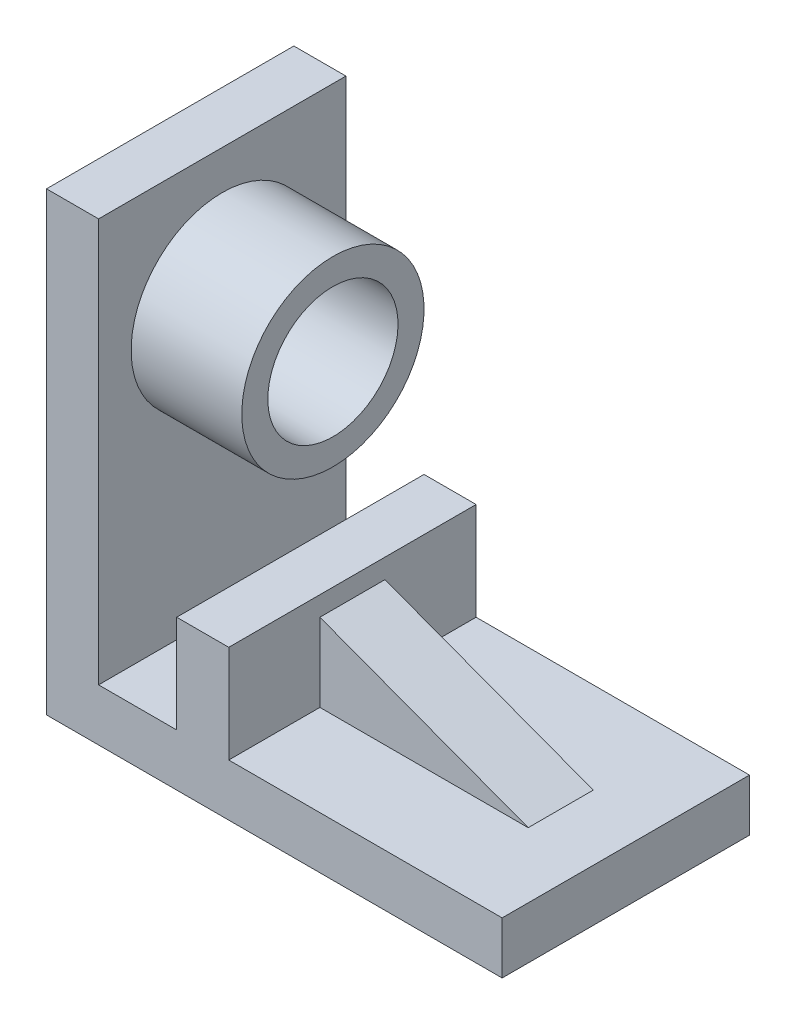
ISO-10303-21;
HEADER;
FILE_DESCRIPTION(('STEP AP214'),'2;1');
FILE_NAME('part.step','',(''),(''),'','','');
FILE_SCHEMA(('AUTOMOTIVE_DESIGN { 1 0 10303 214 1 1 1 1 }'));
ENDSEC;
DATA;
#1=APPLICATION_CONTEXT('core data for automotive mechanical design processes');
#2=APPLICATION_PROTOCOL_DEFINITION('international standard','automotive_design',2000,#1);
#3=PRODUCT_CONTEXT('',#1,'mechanical');
#4=PRODUCT('Part','Part','',(#3));
#5=PRODUCT_RELATED_PRODUCT_CATEGORY('part','',(#4));
#6=PRODUCT_DEFINITION_FORMATION('','',#4);
#7=PRODUCT_DEFINITION_CONTEXT('part definition',#1,'design');
#8=PRODUCT_DEFINITION('design','',#6,#7);
#9=PRODUCT_DEFINITION_SHAPE('','',#8);
#10=(LENGTH_UNIT() NAMED_UNIT(*) SI_UNIT(.MILLI.,.METRE.));
#11=(NAMED_UNIT(*) PLANE_ANGLE_UNIT() SI_UNIT($,.RADIAN.));
#12=(NAMED_UNIT(*) SI_UNIT($,.STERADIAN.) SOLID_ANGLE_UNIT());
#13=UNCERTAINTY_MEASURE_WITH_UNIT(LENGTH_MEASURE(1.E-05),#10,'distance_accuracy_value','');
#14=(GEOMETRIC_REPRESENTATION_CONTEXT(3) GLOBAL_UNCERTAINTY_ASSIGNED_CONTEXT((#13)) GLOBAL_UNIT_ASSIGNED_CONTEXT((#10,
#11,#12)) REPRESENTATION_CONTEXT('',''));
#15=CARTESIAN_POINT('',(0.,0.,0.));
#16=DIRECTION('',(0.,0.,1.));
#17=DIRECTION('',(1.,0.,0.));
#18=AXIS2_PLACEMENT_3D('',#15,#16,#17);
#19=CARTESIAN_POINT('',(-16.0975609756098,-22.1707317073171,38.));
#20=DIRECTION('',(-1.,0.,0.));
#21=DIRECTION('',(0.,-1.,0.));
#22=AXIS2_PLACEMENT_3D('',#19,#20,#21);
#23=PLANE('',#22);
#24=CARTESIAN_POINT('',(-16.0975609756098,19.8292682926829,19.));
#25=DIRECTION('',(-1.,0.,0.));
#26=DIRECTION('',(0.,-1.,0.));
#27=AXIS2_PLACEMENT_3D('',#24,#25,#26);
#28=CIRCLE('',#27,14.);
#29=CARTESIAN_POINT('',(-16.0975609756098,5.82926829268291,19.));
#30=VERTEX_POINT('',#29);
#31=EDGE_CURVE('E11',#30,#30,#28,.F.);
#32=ORIENTED_EDGE('',*,*,#31,.F.);
#33=EDGE_LOOP('',(#32));
#34=FACE_BOUND('',#33,.T.);
#35=DIRECTION('',(0.,0.,-1.));
#36=VECTOR('',#35,1.);
#37=CARTESIAN_POINT('',(-16.0975609756098,-22.1707317073171,38.));
#38=LINE('',#37,#36);
#39=CARTESIAN_POINT('',(-16.0975609756098,-22.1707317073171,38.));
#40=VERTEX_POINT('',#39);
#41=CARTESIAN_POINT('',(-16.0975609756098,-22.1707317073171,0.));
#42=VERTEX_POINT('',#41);
#43=EDGE_CURVE('E181',#40,#42,#38,.T.);
#44=ORIENTED_EDGE('',*,*,#43,.T.);
#45=DIRECTION('',(0.,1.,0.));
#46=VECTOR('',#45,1.);
#47=CARTESIAN_POINT('',(-16.0975609756098,-22.1707317073171,0.));
#48=LINE('',#47,#46);
#49=CARTESIAN_POINT('',(-16.0975609756098,39.8292682926829,0.));
#50=VERTEX_POINT('',#49);
#51=EDGE_CURVE('E158',#42,#50,#48,.T.);
#52=ORIENTED_EDGE('',*,*,#51,.T.);
#53=DIRECTION('',(0.,0.,-1.));
#54=VECTOR('',#53,1.);
#55=CARTESIAN_POINT('',(-16.0975609756098,39.8292682926829,38.));
#56=LINE('',#55,#54);
#57=CARTESIAN_POINT('',(-16.0975609756098,39.8292682926829,38.));
#58=VERTEX_POINT('',#57);
#59=EDGE_CURVE('E42',#58,#50,#56,.T.);
#60=ORIENTED_EDGE('',*,*,#59,.F.);
#61=DIRECTION('',(0.,1.,0.));
#62=VECTOR('',#61,1.);
#63=CARTESIAN_POINT('',(-16.0975609756098,-22.1707317073171,38.));
#64=LINE('',#63,#62);
#65=EDGE_CURVE('E159',#40,#58,#64,.T.);
#66=ORIENTED_EDGE('',*,*,#65,.F.);
#67=EDGE_LOOP('',(#44,#52,#60,#66));
#68=FACE_BOUND('',#67,.T.);
#69=ADVANCED_FACE('F35',(#34,#68),#23,.F.);
#70=CARTESIAN_POINT('',(-16.0975609756098,39.8292682926829,38.));
#71=DIRECTION('',(0.,-1.,0.));
#72=DIRECTION('',(0.,0.,-1.));
#73=AXIS2_PLACEMENT_3D('',#70,#71,#72);
#74=PLANE('',#73);
#75=DIRECTION('',(-1.,0.,0.));
#76=VECTOR('',#75,1.);
#77=CARTESIAN_POINT('',(-16.0975609756098,39.8292682926829,0.));
#78=LINE('',#77,#76);
#79=CARTESIAN_POINT('',(-24.0975609756098,39.8292682926829,0.));
#80=VERTEX_POINT('',#79);
#81=EDGE_CURVE('E184',#50,#80,#78,.T.);
#82=ORIENTED_EDGE('',*,*,#81,.T.);
#83=DIRECTION('',(0.,0.,-1.));
#84=VECTOR('',#83,1.);
#85=CARTESIAN_POINT('',(-24.0975609756098,39.8292682926829,38.));
#86=LINE('',#85,#84);
#87=CARTESIAN_POINT('',(-24.0975609756098,39.8292682926829,38.));
#88=VERTEX_POINT('',#87);
#89=EDGE_CURVE('E225',#88,#80,#86,.T.);
#90=ORIENTED_EDGE('',*,*,#89,.F.);
#91=DIRECTION('',(-1.,0.,0.));
#92=VECTOR('',#91,1.);
#93=CARTESIAN_POINT('',(-16.0975609756098,39.8292682926829,38.));
#94=LINE('',#93,#92);
#95=EDGE_CURVE('E162',#58,#88,#94,.T.);
#96=ORIENTED_EDGE('',*,*,#95,.F.);
#97=ORIENTED_EDGE('',*,*,#59,.T.);
#98=EDGE_LOOP('',(#82,#90,#96,#97));
#99=FACE_BOUND('',#98,.T.);
#100=ADVANCED_FACE('F230',(#99),#74,.F.);
#101=CARTESIAN_POINT('',(-24.0975609756098,39.8292682926829,38.));
#102=DIRECTION('',(1.,0.,0.));
#103=DIRECTION('',(0.,1.,0.));
#104=AXIS2_PLACEMENT_3D('',#101,#102,#103);
#105=PLANE('',#104);
#106=DIRECTION('',(0.,-1.,0.));
#107=VECTOR('',#106,1.);
#108=CARTESIAN_POINT('',(-24.0975609756098,39.8292682926829,0.));
#109=LINE('',#108,#107);
#110=CARTESIAN_POINT('',(-24.0975609756097,-30.1707317073171,0.));
#111=VERTEX_POINT('',#110);
#112=EDGE_CURVE('E186',#80,#111,#109,.T.);
#113=ORIENTED_EDGE('',*,*,#112,.T.);
#114=DIRECTION('',(0.,0.,-1.));
#115=VECTOR('',#114,1.);
#116=CARTESIAN_POINT('',(-24.0975609756097,-30.1707317073171,38.));
#117=LINE('',#116,#115);
#118=CARTESIAN_POINT('',(-24.0975609756097,-30.1707317073171,38.));
#119=VERTEX_POINT('',#118);
#120=EDGE_CURVE('E223',#119,#111,#117,.T.);
#121=ORIENTED_EDGE('',*,*,#120,.F.);
#122=DIRECTION('',(0.,-1.,0.));
#123=VECTOR('',#122,1.);
#124=CARTESIAN_POINT('',(-24.0975609756098,39.8292682926829,38.));
#125=LINE('',#124,#123);
#126=EDGE_CURVE('E165',#88,#119,#125,.T.);
#127=ORIENTED_EDGE('',*,*,#126,.F.);
#128=ORIENTED_EDGE('',*,*,#89,.T.);
#129=EDGE_LOOP('',(#113,#121,#127,#128));
#130=FACE_BOUND('',#129,.T.);
#131=ADVANCED_FACE('F245',(#130),#105,.F.);
#132=CARTESIAN_POINT('',(-24.0975609756097,-30.1707317073171,38.));
#133=DIRECTION('',(0.,1.,0.));
#134=DIRECTION('',(-1.,0.,0.));
#135=AXIS2_PLACEMENT_3D('',#132,#133,#134);
#136=PLANE('',#135);
#137=ORIENTED_EDGE('',*,*,#120,.T.);
#138=DIRECTION('',(1.,0.,0.));
#139=VECTOR('',#138,1.);
#140=CARTESIAN_POINT('',(-24.0975609756097,-30.1707317073171,0.));
#141=LINE('',#140,#139);
#142=CARTESIAN_POINT('',(45.9024390243903,-30.1707317073171,0.));
#143=VERTEX_POINT('',#142);
#144=EDGE_CURVE('E189',#111,#143,#141,.T.);
#145=ORIENTED_EDGE('',*,*,#144,.T.);
#146=DIRECTION('',(0.,0.,-1.));
#147=VECTOR('',#146,1.);
#148=CARTESIAN_POINT('',(45.9024390243903,-30.1707317073171,38.));
#149=LINE('',#148,#147);
#150=CARTESIAN_POINT('',(45.9024390243903,-30.1707317073171,38.));
#151=VERTEX_POINT('',#150);
#152=EDGE_CURVE('E221',#151,#143,#149,.T.);
#153=ORIENTED_EDGE('',*,*,#152,.F.);
#154=DIRECTION('',(1.,0.,0.));
#155=VECTOR('',#154,1.);
#156=CARTESIAN_POINT('',(-24.0975609756097,-30.1707317073171,38.));
#157=LINE('',#156,#155);
#158=EDGE_CURVE('E167',#119,#151,#157,.T.);
#159=ORIENTED_EDGE('',*,*,#158,.F.);
#160=EDGE_LOOP('',(#137,#145,#153,#159));
#161=FACE_BOUND('',#160,.T.);
#162=ADVANCED_FACE('F274',(#161),#136,.F.);
#163=CARTESIAN_POINT('',(45.9024390243903,-30.1707317073171,38.));
#164=DIRECTION('',(-1.,0.,0.));
#165=DIRECTION('',(0.,0.,1.));
#166=AXIS2_PLACEMENT_3D('',#163,#164,#165);
#167=PLANE('',#166);
#168=ORIENTED_EDGE('',*,*,#152,.T.);
#169=DIRECTION('',(0.,1.,0.));
#170=VECTOR('',#169,1.);
#171=CARTESIAN_POINT('',(45.9024390243903,-30.1707317073171,0.));
#172=LINE('',#171,#170);
#173=CARTESIAN_POINT('',(45.9024390243903,-22.1707317073171,0.));
#174=VERTEX_POINT('',#173);
#175=EDGE_CURVE('E192',#143,#174,#172,.T.);
#176=ORIENTED_EDGE('',*,*,#175,.T.);
#177=DIRECTION('',(0.,0.,-1.));
#178=VECTOR('',#177,1.);
#179=CARTESIAN_POINT('',(45.9024390243903,-22.1707317073171,38.));
#180=LINE('',#179,#178);
#181=CARTESIAN_POINT('',(45.9024390243903,-22.1707317073171,38.));
#182=VERTEX_POINT('',#181);
#183=EDGE_CURVE('E218',#182,#174,#180,.T.);
#184=ORIENTED_EDGE('',*,*,#183,.F.);
#185=DIRECTION('',(0.,1.,0.));
#186=VECTOR('',#185,1.);
#187=CARTESIAN_POINT('',(45.9024390243903,-30.1707317073171,38.));
#188=LINE('',#187,#186);
#189=EDGE_CURVE('E169',#151,#182,#188,.T.);
#190=ORIENTED_EDGE('',*,*,#189,.F.);
#191=EDGE_LOOP('',(#168,#176,#184,#190));
#192=FACE_BOUND('',#191,.T.);
#193=ADVANCED_FACE('F271',(#192),#167,.F.);
#194=CARTESIAN_POINT('',(45.9024390243903,-22.1707317073171,38.));
#195=DIRECTION('',(0.,-1.,0.));
#196=DIRECTION('',(1.,0.,0.));
#197=AXIS2_PLACEMENT_3D('',#194,#195,#196);
#198=PLANE('',#197);
#199=DIRECTION('',(0.,0.,-1.));
#200=VECTOR('',#199,1.);
#201=CARTESIAN_POINT('',(35.9024390243902,-22.1707317073171,38.));
#202=LINE('',#201,#200);
#203=CARTESIAN_POINT('',(35.9024390243902,-22.1707317073171,14.));
#204=VERTEX_POINT('',#203);
#205=CARTESIAN_POINT('',(35.9024390243902,-22.1707317073171,24.));
#206=VERTEX_POINT('',#205);
#207=EDGE_CURVE('E49',#204,#206,#202,.F.);
#208=ORIENTED_EDGE('',*,*,#207,.T.);
#209=DIRECTION('',(-1.,0.,0.));
#210=VECTOR('',#209,1.);
#211=CARTESIAN_POINT('',(45.9024390243903,-22.1707317073171,24.));
#212=LINE('',#211,#210);
#213=CARTESIAN_POINT('',(3.90243902439021,-22.1707317073171,24.));
#214=VERTEX_POINT('',#213);
#215=EDGE_CURVE('E138',#206,#214,#212,.T.);
#216=ORIENTED_EDGE('',*,*,#215,.T.);
#217=DIRECTION('',(0.,0.,-1.));
#218=VECTOR('',#217,1.);
#219=CARTESIAN_POINT('',(3.90243902439021,-22.1707317073171,38.));
#220=LINE('',#219,#218);
#221=CARTESIAN_POINT('',(3.90243902439021,-22.1707317073171,38.));
#222=VERTEX_POINT('',#221);
#223=EDGE_CURVE('E216',#222,#214,#220,.T.);
#224=ORIENTED_EDGE('',*,*,#223,.F.);
#225=DIRECTION('',(-1.,0.,0.));
#226=VECTOR('',#225,1.);
#227=CARTESIAN_POINT('',(45.9024390243903,-22.1707317073171,38.));
#228=LINE('',#227,#226);
#229=EDGE_CURVE('E171',#182,#222,#228,.T.);
#230=ORIENTED_EDGE('',*,*,#229,.F.);
#231=ORIENTED_EDGE('',*,*,#183,.T.);
#232=DIRECTION('',(-1.,0.,0.));
#233=VECTOR('',#232,1.);
#234=CARTESIAN_POINT('',(45.9024390243903,-22.1707317073171,0.));
#235=LINE('',#234,#233);
#236=CARTESIAN_POINT('',(3.90243902439021,-22.1707317073171,0.));
#237=VERTEX_POINT('',#236);
#238=EDGE_CURVE('E194',#174,#237,#235,.T.);
#239=ORIENTED_EDGE('',*,*,#238,.T.);
#240=CARTESIAN_POINT('',(3.90243902439021,-22.1707317073171,14.));
#241=VERTEX_POINT('',#240);
#242=EDGE_CURVE('E215',#241,#237,#220,.T.);
#243=ORIENTED_EDGE('',*,*,#242,.F.);
#244=DIRECTION('',(-1.,0.,0.));
#245=VECTOR('',#244,1.);
#246=CARTESIAN_POINT('',(45.9024390243903,-22.1707317073171,14.));
#247=LINE('',#246,#245);
#248=EDGE_CURVE('E54',#204,#241,#247,.T.);
#249=ORIENTED_EDGE('',*,*,#248,.F.);
#250=EDGE_LOOP('',(#208,#216,#224,#230,#231,#239,#243,#249));
#251=FACE_BOUND('',#250,.T.);
#252=ADVANCED_FACE('F267',(#251),#198,.F.);
#253=CARTESIAN_POINT('',(3.90243902439021,-22.1707317073171,38.));
#254=DIRECTION('',(-1.,0.,0.));
#255=DIRECTION('',(0.,-1.,0.));
#256=AXIS2_PLACEMENT_3D('',#253,#254,#255);
#257=PLANE('',#256);
#258=ORIENTED_EDGE('',*,*,#223,.T.);
#259=DIRECTION('',(0.,1.,0.));
#260=VECTOR('',#259,1.);
#261=CARTESIAN_POINT('',(3.90243902439021,-22.1707317073171,24.));
#262=LINE('',#261,#260);
#263=CARTESIAN_POINT('',(3.90243902439022,-10.1707317073171,24.));
#264=VERTEX_POINT('',#263);
#265=EDGE_CURVE('E133',#214,#264,#262,.T.);
#266=ORIENTED_EDGE('',*,*,#265,.T.);
#267=DIRECTION('',(0.,0.,1.));
#268=VECTOR('',#267,1.);
#269=CARTESIAN_POINT('',(3.90243902439022,-10.1707317073171,38.));
#270=LINE('',#269,#268);
#271=CARTESIAN_POINT('',(3.90243902439022,-10.1707317073171,14.));
#272=VERTEX_POINT('',#271);
#273=EDGE_CURVE('E127',#264,#272,#270,.F.);
#274=ORIENTED_EDGE('',*,*,#273,.T.);
#275=DIRECTION('',(0.,1.,0.));
#276=VECTOR('',#275,1.);
#277=CARTESIAN_POINT('',(3.90243902439021,-22.1707317073171,14.));
#278=LINE('',#277,#276);
#279=EDGE_CURVE('E131',#241,#272,#278,.T.);
#280=ORIENTED_EDGE('',*,*,#279,.F.);
#281=ORIENTED_EDGE('',*,*,#242,.T.);
#282=DIRECTION('',(0.,1.,0.));
#283=VECTOR('',#282,1.);
#284=CARTESIAN_POINT('',(3.90243902439021,-22.1707317073171,0.));
#285=LINE('',#284,#283);
#286=CARTESIAN_POINT('',(3.90243902439022,-7.17073170731709,0.));
#287=VERTEX_POINT('',#286);
#288=EDGE_CURVE('E197',#237,#287,#285,.T.);
#289=ORIENTED_EDGE('',*,*,#288,.T.);
#290=DIRECTION('',(0.,0.,-1.));
#291=VECTOR('',#290,1.);
#292=CARTESIAN_POINT('',(3.90243902439022,-7.17073170731709,38.));
#293=LINE('',#292,#291);
#294=CARTESIAN_POINT('',(3.90243902439022,-7.17073170731709,38.));
#295=VERTEX_POINT('',#294);
#296=EDGE_CURVE('E212',#295,#287,#293,.T.);
#297=ORIENTED_EDGE('',*,*,#296,.F.);
#298=DIRECTION('',(0.,1.,0.));
#299=VECTOR('',#298,1.);
#300=CARTESIAN_POINT('',(3.90243902439021,-22.1707317073171,38.));
#301=LINE('',#300,#299);
#302=EDGE_CURVE('E173',#222,#295,#301,.T.);
#303=ORIENTED_EDGE('',*,*,#302,.F.);
#304=EDGE_LOOP('',(#258,#266,#274,#280,#281,#289,#297,#303));
#305=FACE_BOUND('',#304,.T.);
#306=ADVANCED_FACE('F130',(#305),#257,.F.);
#307=CARTESIAN_POINT('',(3.90243902439022,-7.17073170731709,38.));
#308=DIRECTION('',(0.,-1.,0.));
#309=DIRECTION('',(0.,0.,-1.));
#310=AXIS2_PLACEMENT_3D('',#307,#308,#309);
#311=PLANE('',#310);
#312=DIRECTION('',(-1.,0.,0.));
#313=VECTOR('',#312,1.);
#314=CARTESIAN_POINT('',(3.90243902439022,-7.17073170731709,0.));
#315=LINE('',#314,#313);
#316=CARTESIAN_POINT('',(-4.09756097560978,-7.17073170731709,0.));
#317=VERTEX_POINT('',#316);
#318=EDGE_CURVE('E199',#287,#317,#315,.T.);
#319=ORIENTED_EDGE('',*,*,#318,.T.);
#320=DIRECTION('',(0.,0.,-1.));
#321=VECTOR('',#320,1.);
#322=CARTESIAN_POINT('',(-4.09756097560978,-7.17073170731709,38.));
#323=LINE('',#322,#321);
#324=CARTESIAN_POINT('',(-4.09756097560978,-7.17073170731709,38.));
#325=VERTEX_POINT('',#324);
#326=EDGE_CURVE('E210',#325,#317,#323,.T.);
#327=ORIENTED_EDGE('',*,*,#326,.F.);
#328=DIRECTION('',(-1.,0.,0.));
#329=VECTOR('',#328,1.);
#330=CARTESIAN_POINT('',(3.90243902439022,-7.17073170731709,38.));
#331=LINE('',#330,#329);
#332=EDGE_CURVE('E175',#295,#325,#331,.T.);
#333=ORIENTED_EDGE('',*,*,#332,.F.);
#334=ORIENTED_EDGE('',*,*,#296,.T.);
#335=EDGE_LOOP('',(#319,#327,#333,#334));
#336=FACE_BOUND('',#335,.T.);
#337=ADVANCED_FACE('F263',(#336),#311,.F.);
#338=CARTESIAN_POINT('',(-4.09756097560978,-7.17073170731709,38.));
#339=DIRECTION('',(1.,0.,0.));
#340=DIRECTION('',(0.,1.,0.));
#341=AXIS2_PLACEMENT_3D('',#338,#339,#340);
#342=PLANE('',#341);
#343=ORIENTED_EDGE('',*,*,#326,.T.);
#344=DIRECTION('',(0.,-1.,0.));
#345=VECTOR('',#344,1.);
#346=CARTESIAN_POINT('',(-4.09756097560978,-7.17073170731709,0.));
#347=LINE('',#346,#345);
#348=CARTESIAN_POINT('',(-4.09756097560978,-22.1707317073171,0.));
#349=VERTEX_POINT('',#348);
#350=EDGE_CURVE('E202',#317,#349,#347,.T.);
#351=ORIENTED_EDGE('',*,*,#350,.T.);
#352=DIRECTION('',(0.,0.,-1.));
#353=VECTOR('',#352,1.);
#354=CARTESIAN_POINT('',(-4.09756097560978,-22.1707317073171,38.));
#355=LINE('',#354,#353);
#356=CARTESIAN_POINT('',(-4.09756097560978,-22.1707317073171,38.));
#357=VERTEX_POINT('',#356);
#358=EDGE_CURVE('E208',#357,#349,#355,.T.);
#359=ORIENTED_EDGE('',*,*,#358,.F.);
#360=DIRECTION('',(0.,-1.,0.));
#361=VECTOR('',#360,1.);
#362=CARTESIAN_POINT('',(-4.09756097560978,-7.17073170731709,38.));
#363=LINE('',#362,#361);
#364=EDGE_CURVE('E177',#325,#357,#363,.T.);
#365=ORIENTED_EDGE('',*,*,#364,.F.);
#366=EDGE_LOOP('',(#343,#351,#359,#365));
#367=FACE_BOUND('',#366,.T.);
#368=ADVANCED_FACE('F257',(#367),#342,.F.);
#369=CARTESIAN_POINT('',(-4.09756097560978,-22.1707317073171,38.));
#370=DIRECTION('',(0.,-1.,0.));
#371=DIRECTION('',(1.,0.,0.));
#372=AXIS2_PLACEMENT_3D('',#369,#370,#371);
#373=PLANE('',#372);
#374=ORIENTED_EDGE('',*,*,#358,.T.);
#375=DIRECTION('',(-1.,0.,0.));
#376=VECTOR('',#375,1.);
#377=CARTESIAN_POINT('',(-4.09756097560978,-22.1707317073171,0.));
#378=LINE('',#377,#376);
#379=EDGE_CURVE('E163',#349,#42,#378,.T.);
#380=ORIENTED_EDGE('',*,*,#379,.T.);
#381=ORIENTED_EDGE('',*,*,#43,.F.);
#382=DIRECTION('',(-1.,0.,0.));
#383=VECTOR('',#382,1.);
#384=CARTESIAN_POINT('',(-4.09756097560978,-22.1707317073171,38.));
#385=LINE('',#384,#383);
#386=EDGE_CURVE('E179',#357,#40,#385,.T.);
#387=ORIENTED_EDGE('',*,*,#386,.F.);
#388=EDGE_LOOP('',(#374,#380,#381,#387));
#389=FACE_BOUND('',#388,.T.);
#390=ADVANCED_FACE('F255',(#389),#373,.F.);
#391=CARTESIAN_POINT('',(0.,0.,38.));
#392=DIRECTION('',(0.,0.,1.));
#393=DIRECTION('',(1.,0.,0.));
#394=AXIS2_PLACEMENT_3D('',#391,#392,#393);
#395=PLANE('',#394);
#396=ORIENTED_EDGE('',*,*,#65,.T.);
#397=ORIENTED_EDGE('',*,*,#95,.T.);
#398=ORIENTED_EDGE('',*,*,#126,.T.);
#399=ORIENTED_EDGE('',*,*,#158,.T.);
#400=ORIENTED_EDGE('',*,*,#189,.T.);
#401=ORIENTED_EDGE('',*,*,#229,.T.);
#402=ORIENTED_EDGE('',*,*,#302,.T.);
#403=ORIENTED_EDGE('',*,*,#332,.T.);
#404=ORIENTED_EDGE('',*,*,#364,.T.);
#405=ORIENTED_EDGE('',*,*,#386,.T.);
#406=EDGE_LOOP('',(#396,#397,#398,#399,#400,#401,#402,#403,#404,#405));
#407=FACE_BOUND('',#406,.T.);
#408=ADVANCED_FACE('F249',(#407),#395,.T.);
#409=CARTESIAN_POINT('',(0.,0.,0.));
#410=DIRECTION('',(0.,0.,1.));
#411=DIRECTION('',(1.,0.,0.));
#412=AXIS2_PLACEMENT_3D('',#409,#410,#411);
#413=PLANE('',#412);
#414=ORIENTED_EDGE('',*,*,#51,.F.);
#415=ORIENTED_EDGE('',*,*,#379,.F.);
#416=ORIENTED_EDGE('',*,*,#350,.F.);
#417=ORIENTED_EDGE('',*,*,#318,.F.);
#418=ORIENTED_EDGE('',*,*,#288,.F.);
#419=ORIENTED_EDGE('',*,*,#238,.F.);
#420=ORIENTED_EDGE('',*,*,#175,.F.);
#421=ORIENTED_EDGE('',*,*,#144,.F.);
#422=ORIENTED_EDGE('',*,*,#112,.F.);
#423=ORIENTED_EDGE('',*,*,#81,.F.);
#424=EDGE_LOOP('',(#414,#415,#416,#417,#418,#419,#420,#421,#422,#423));
#425=FACE_BOUND('',#424,.T.);
#426=ADVANCED_FACE('F238',(#425),#413,.F.);
#427=CARTESIAN_POINT('',(3.90243902439021,-10.1707317073171,19.));
#428=DIRECTION('',(-0.351123441588392,-0.936329177569045,0.));
#429=DIRECTION('',(0.936329177569045,-0.351123441588392,0.));
#430=AXIS2_PLACEMENT_3D('',#427,#428,#429);
#431=PLANE('',#430);
#432=ORIENTED_EDGE('',*,*,#207,.F.);
#433=DIRECTION('',(0.936329177569045,-0.351123441588392,0.));
#434=VECTOR('',#433,1.);
#435=CARTESIAN_POINT('',(3.90243902439021,-10.1707317073171,14.));
#436=LINE('',#435,#434);
#437=EDGE_CURVE('E143',#272,#204,#436,.T.);
#438=ORIENTED_EDGE('',*,*,#437,.F.);
#439=ORIENTED_EDGE('',*,*,#273,.F.);
#440=DIRECTION('',(0.936329177569045,-0.351123441588392,0.));
#441=VECTOR('',#440,1.);
#442=CARTESIAN_POINT('',(3.90243902439021,-10.1707317073171,24.));
#443=LINE('',#442,#441);
#444=EDGE_CURVE('E144',#264,#206,#443,.T.);
#445=ORIENTED_EDGE('',*,*,#444,.T.);
#446=EDGE_LOOP('',(#432,#438,#439,#445));
#447=FACE_BOUND('',#446,.T.);
#448=ADVANCED_FACE('F146',(#447),#431,.F.);
#449=CARTESIAN_POINT('',(10.9024390243902,4.82926829268292,24.));
#450=DIRECTION('',(0.,0.,1.));
#451=DIRECTION('',(1.,0.,0.));
#452=AXIS2_PLACEMENT_3D('',#449,#450,#451);
#453=PLANE('',#452);
#454=ORIENTED_EDGE('',*,*,#215,.F.);
#455=ORIENTED_EDGE('',*,*,#444,.F.);
#456=ORIENTED_EDGE('',*,*,#265,.F.);
#457=EDGE_LOOP('',(#454,#455,#456));
#458=FACE_BOUND('',#457,.T.);
#459=ADVANCED_FACE('F318',(#458),#453,.T.);
#460=CARTESIAN_POINT('',(10.9024390243902,4.82926829268292,14.));
#461=DIRECTION('',(0.,0.,1.));
#462=DIRECTION('',(1.,0.,0.));
#463=AXIS2_PLACEMENT_3D('',#460,#461,#462);
#464=PLANE('',#463);
#465=ORIENTED_EDGE('',*,*,#437,.T.);
#466=ORIENTED_EDGE('',*,*,#248,.T.);
#467=ORIENTED_EDGE('',*,*,#279,.T.);
#468=EDGE_LOOP('',(#465,#466,#467));
#469=FACE_BOUND('',#468,.T.);
#470=ADVANCED_FACE('F142',(#469),#464,.F.);
#471=CARTESIAN_POINT('',(0.902439024390214,19.8292682926829,19.));
#472=DIRECTION('',(1.,0.,0.));
#473=DIRECTION('',(0.,1.,0.));
#474=AXIS2_PLACEMENT_3D('',#471,#472,#473);
#475=PLANE('',#474);
#476=CARTESIAN_POINT('',(0.902439024390214,19.8292682926829,19.));
#477=DIRECTION('',(1.,0.,0.));
#478=DIRECTION('',(0.,1.,0.));
#479=AXIS2_PLACEMENT_3D('',#476,#477,#478);
#480=CIRCLE('',#479,14.);
#481=CARTESIAN_POINT('',(0.90243902439021,33.8292682926829,19.));
#482=VERTEX_POINT('',#481);
#483=EDGE_CURVE('E147',#482,#482,#480,.T.);
#484=ORIENTED_EDGE('',*,*,#483,.T.);
#485=EDGE_LOOP('',(#484));
#486=FACE_BOUND('',#485,.T.);
#487=CARTESIAN_POINT('',(0.902439024390214,19.8292682926829,19.));
#488=DIRECTION('',(1.,0.,0.));
#489=DIRECTION('',(0.,1.,0.));
#490=AXIS2_PLACEMENT_3D('',#487,#488,#489);
#491=CIRCLE('',#490,10.);
#492=CARTESIAN_POINT('',(0.902439024390211,29.8292682926829,19.));
#493=VERTEX_POINT('',#492);
#494=EDGE_CURVE('E151',#493,#493,#491,.T.);
#495=ORIENTED_EDGE('',*,*,#494,.F.);
#496=EDGE_LOOP('',(#495));
#497=FACE_BOUND('',#496,.T.);
#498=ADVANCED_FACE('F308',(#486,#497),#475,.T.);
#499=CARTESIAN_POINT('',(0.902439024390214,19.8292682926829,19.));
#500=DIRECTION('',(-1.,0.,0.));
#501=DIRECTION('',(0.,-1.,0.));
#502=AXIS2_PLACEMENT_3D('',#499,#500,#501);
#503=CYLINDRICAL_SURFACE('',#502,14.);
#504=ORIENTED_EDGE('',*,*,#483,.F.);
#505=EDGE_LOOP('',(#504));
#506=FACE_BOUND('',#505,.T.);
#507=ORIENTED_EDGE('',*,*,#31,.T.);
#508=EDGE_LOOP('',(#507));
#509=FACE_BOUND('',#508,.T.);
#510=ADVANCED_FACE('F296',(#506,#509),#503,.T.);
#511=CARTESIAN_POINT('',(0.902439024390214,19.8292682926829,19.));
#512=DIRECTION('',(-1.,0.,0.));
#513=DIRECTION('',(0.,-1.,0.));
#514=AXIS2_PLACEMENT_3D('',#511,#512,#513);
#515=CYLINDRICAL_SURFACE('',#514,10.);
#516=ORIENTED_EDGE('',*,*,#494,.T.);
#517=EDGE_LOOP('',(#516));
#518=FACE_BOUND('',#517,.T.);
#519=CARTESIAN_POINT('',(-16.0975609756098,19.8292682926829,19.));
#520=DIRECTION('',(1.,0.,0.));
#521=DIRECTION('',(0.,1.,0.));
#522=AXIS2_PLACEMENT_3D('',#519,#520,#521);
#523=CIRCLE('',#522,10.);
#524=CARTESIAN_POINT('',(-16.0975609756098,29.8292682926829,19.));
#525=VERTEX_POINT('',#524);
#526=EDGE_CURVE('E301',#525,#525,#523,.T.);
#527=ORIENTED_EDGE('',*,*,#526,.F.);
#528=EDGE_LOOP('',(#527));
#529=FACE_BOUND('',#528,.T.);
#530=ADVANCED_FACE('F291',(#518,#529),#515,.F.);
#531=ORIENTED_EDGE('',*,*,#526,.T.);
#532=EDGE_LOOP('',(#531));
#533=FACE_BOUND('',#532,.T.);
#534=ADVANCED_FACE('F285',(#533),#23,.F.);
#535=CLOSED_SHELL('',(#69,#100,#131,#162,#193,#252,#306,#337,#368,#390,#408,#426,#448,#459,#470,
#498,#510,#530,#534));
#536=MANIFOLD_SOLID_BREP('B2',#535);
#537=ADVANCED_BREP_SHAPE_REPRESENTATION('',(#18,#536),#14);
#538=SHAPE_DEFINITION_REPRESENTATION(#9,#537);
ENDSEC;
END-ISO-10303-21;
